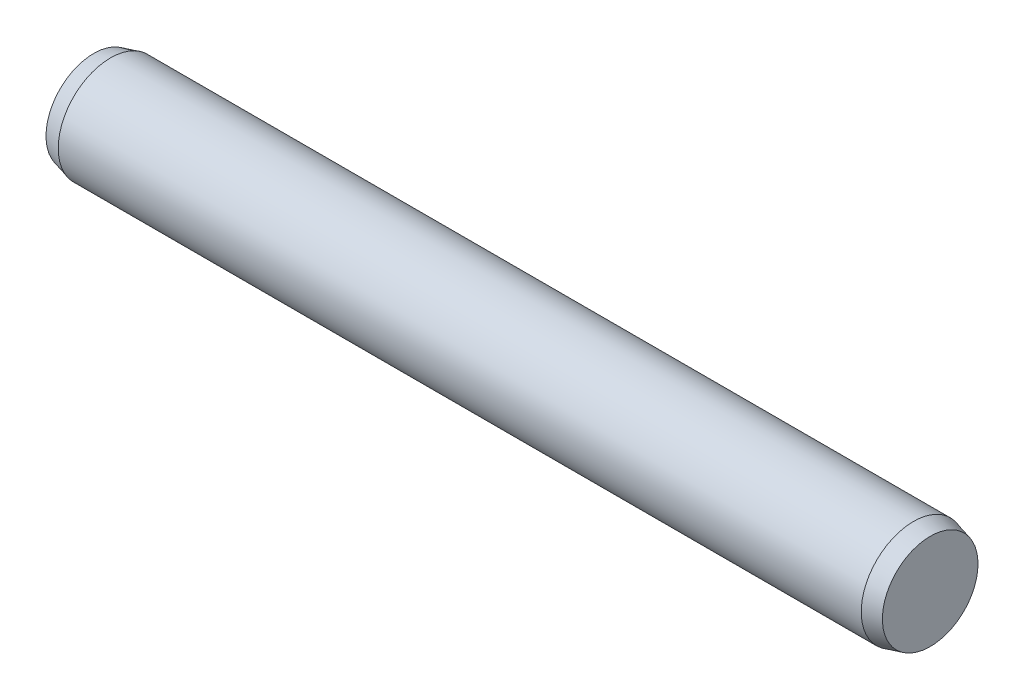
ISO-10303-21;
HEADER;
FILE_DESCRIPTION(('STEP AP214'),'2;1');
FILE_NAME('part.step','',(''),(''),'','','');
FILE_SCHEMA(('AUTOMOTIVE_DESIGN { 1 0 10303 214 1 1 1 1 }'));
ENDSEC;
DATA;
#1=APPLICATION_CONTEXT('core data for automotive mechanical design processes');
#2=APPLICATION_PROTOCOL_DEFINITION('international standard','automotive_design',2000,#1);
#3=PRODUCT_CONTEXT('',#1,'mechanical');
#4=PRODUCT('Part','Part','',(#3));
#5=PRODUCT_RELATED_PRODUCT_CATEGORY('part','',(#4));
#6=PRODUCT_DEFINITION_FORMATION('','',#4);
#7=PRODUCT_DEFINITION_CONTEXT('part definition',#1,'design');
#8=PRODUCT_DEFINITION('design','',#6,#7);
#9=PRODUCT_DEFINITION_SHAPE('','',#8);
#10=(LENGTH_UNIT() NAMED_UNIT(*) SI_UNIT(.MILLI.,.METRE.));
#11=(NAMED_UNIT(*) PLANE_ANGLE_UNIT() SI_UNIT($,.RADIAN.));
#12=(NAMED_UNIT(*) SI_UNIT($,.STERADIAN.) SOLID_ANGLE_UNIT());
#13=UNCERTAINTY_MEASURE_WITH_UNIT(LENGTH_MEASURE(1.E-05),#10,'distance_accuracy_value','');
#14=(GEOMETRIC_REPRESENTATION_CONTEXT(3) GLOBAL_UNCERTAINTY_ASSIGNED_CONTEXT((#13)) GLOBAL_UNIT_ASSIGNED_CONTEXT((#10,
#11,#12)) REPRESENTATION_CONTEXT('',''));
#15=CARTESIAN_POINT('',(0.,0.,0.));
#16=DIRECTION('',(0.,0.,1.));
#17=DIRECTION('',(1.,0.,0.));
#18=AXIS2_PLACEMENT_3D('',#15,#16,#17);
#19=CARTESIAN_POINT('',(-19.2,0.,0.));
#20=DIRECTION('',(1.,0.,0.));
#21=DIRECTION('',(0.,0.,-1.));
#22=AXIS2_PLACEMENT_3D('',#19,#20,#21);
#23=CYLINDRICAL_SURFACE('',#22,2.5);
#24=CARTESIAN_POINT('',(-19.2,0.,0.));
#25=DIRECTION('',(-1.,0.,0.));
#26=DIRECTION('',(0.,0.,1.));
#27=AXIS2_PLACEMENT_3D('',#24,#25,#26);
#28=CIRCLE('',#27,2.5);
#29=CARTESIAN_POINT('',(-19.2,0.,2.5));
#30=VERTEX_POINT('',#29);
#31=EDGE_CURVE('E44',#30,#30,#28,.T.);
#32=ORIENTED_EDGE('',*,*,#31,.F.);
#33=EDGE_LOOP('',(#32));
#34=FACE_BOUND('',#33,.T.);
#35=CARTESIAN_POINT('',(19.2,0.,0.));
#36=DIRECTION('',(1.,0.,0.));
#37=DIRECTION('',(0.,0.,-1.));
#38=AXIS2_PLACEMENT_3D('',#35,#36,#37);
#39=CIRCLE('',#38,2.5);
#40=CARTESIAN_POINT('',(19.2,0.,-2.5));
#41=VERTEX_POINT('',#40);
#42=EDGE_CURVE('E10',#41,#41,#39,.T.);
#43=ORIENTED_EDGE('',*,*,#42,.F.);
#44=EDGE_LOOP('',(#43));
#45=FACE_BOUND('',#44,.T.);
#46=ADVANCED_FACE('F30',(#34,#45),#23,.T.);
#47=CARTESIAN_POINT('',(19.2,0.,0.));
#48=DIRECTION('',(-1.,0.,0.));
#49=DIRECTION('',(0.,0.,-1.));
#50=AXIS2_PLACEMENT_3D('',#47,#48,#49);
#51=CONICAL_SURFACE('',#50,2.5,0.26179938779915);
#52=CARTESIAN_POINT('',(20.,0.,0.));
#53=DIRECTION('',(1.,0.,0.));
#54=DIRECTION('',(0.,0.,-1.));
#55=AXIS2_PLACEMENT_3D('',#52,#53,#54);
#56=CIRCLE('',#55,2.2856406460551);
#57=CARTESIAN_POINT('',(20.,0.,-2.2856406460551));
#58=VERTEX_POINT('',#57);
#59=EDGE_CURVE('E36',#58,#58,#56,.T.);
#60=ORIENTED_EDGE('',*,*,#59,.F.);
#61=EDGE_LOOP('',(#60));
#62=FACE_BOUND('',#61,.T.);
#63=ORIENTED_EDGE('',*,*,#42,.T.);
#64=EDGE_LOOP('',(#63));
#65=FACE_BOUND('',#64,.T.);
#66=ADVANCED_FACE('F54',(#62,#65),#51,.T.);
#67=CARTESIAN_POINT('',(20.,0.,0.));
#68=DIRECTION('',(1.,0.,0.));
#69=DIRECTION('',(0.,0.,-1.));
#70=AXIS2_PLACEMENT_3D('',#67,#68,#69);
#71=PLANE('',#70);
#72=ORIENTED_EDGE('',*,*,#59,.T.);
#73=EDGE_LOOP('',(#72));
#74=FACE_BOUND('',#73,.T.);
#75=ADVANCED_FACE('F58',(#74),#71,.T.);
#76=CARTESIAN_POINT('',(-19.2,0.,0.));
#77=DIRECTION('',(1.,0.,0.));
#78=DIRECTION('',(0.,0.,1.));
#79=AXIS2_PLACEMENT_3D('',#76,#77,#78);
#80=CONICAL_SURFACE('',#79,2.5,0.26179938779915);
#81=CARTESIAN_POINT('',(-20.,0.,0.));
#82=DIRECTION('',(-1.,0.,0.));
#83=DIRECTION('',(0.,0.,1.));
#84=AXIS2_PLACEMENT_3D('',#81,#82,#83);
#85=CIRCLE('',#84,2.2856406460551);
#86=CARTESIAN_POINT('',(-20.,0.,2.2856406460551));
#87=VERTEX_POINT('',#86);
#88=EDGE_CURVE('E40',#87,#87,#85,.T.);
#89=ORIENTED_EDGE('',*,*,#88,.F.);
#90=EDGE_LOOP('',(#89));
#91=FACE_BOUND('',#90,.T.);
#92=ORIENTED_EDGE('',*,*,#31,.T.);
#93=EDGE_LOOP('',(#92));
#94=FACE_BOUND('',#93,.T.);
#95=ADVANCED_FACE('F50',(#91,#94),#80,.T.);
#96=CARTESIAN_POINT('',(-20.,0.,0.));
#97=DIRECTION('',(-1.,0.,0.));
#98=DIRECTION('',(0.,0.,1.));
#99=AXIS2_PLACEMENT_3D('',#96,#97,#98);
#100=PLANE('',#99);
#101=ORIENTED_EDGE('',*,*,#88,.T.);
#102=EDGE_LOOP('',(#101));
#103=FACE_BOUND('',#102,.T.);
#104=ADVANCED_FACE('F67',(#103),#100,.T.);
#105=CLOSED_SHELL('',(#46,#66,#75,#95,#104));
#106=MANIFOLD_SOLID_BREP('B2',#105);
#107=ADVANCED_BREP_SHAPE_REPRESENTATION('',(#18,#106),#14);
#108=SHAPE_DEFINITION_REPRESENTATION(#9,#107);
ENDSEC;
END-ISO-10303-21;
